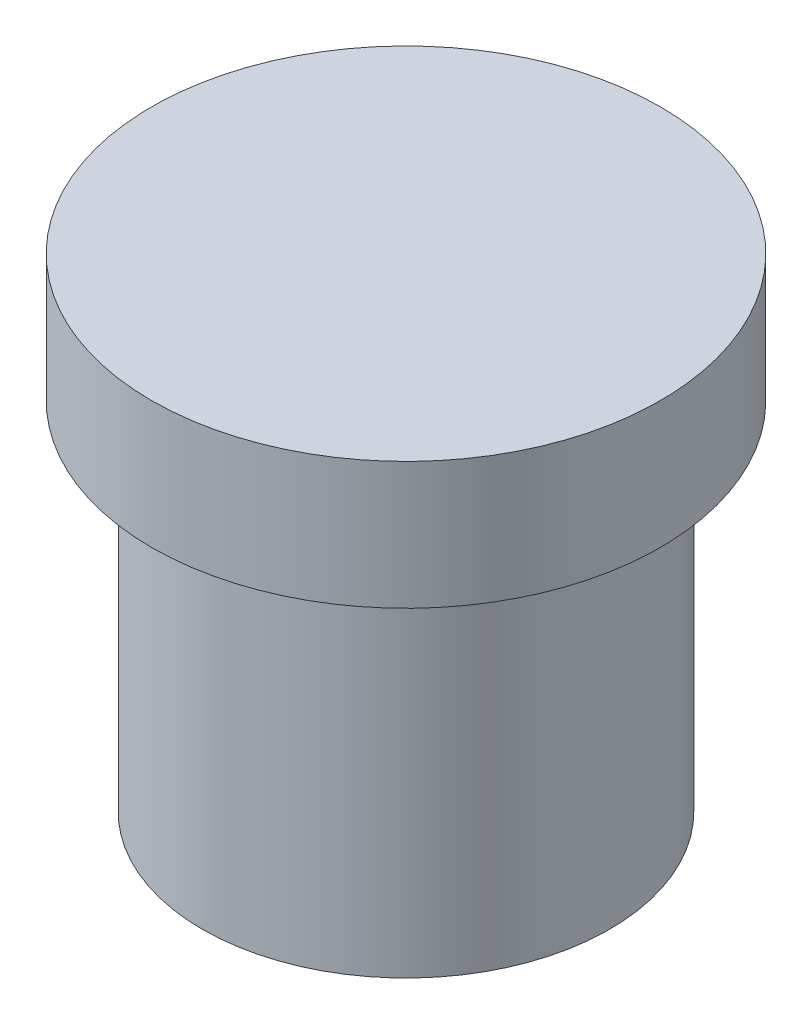
ISO-10303-21;
HEADER;
FILE_DESCRIPTION(('STEP AP214'),'2;1');
FILE_NAME('part.step','',(''),(''),'','','');
FILE_SCHEMA(('AUTOMOTIVE_DESIGN { 1 0 10303 214 1 1 1 1 }'));
ENDSEC;
DATA;
#1=APPLICATION_CONTEXT('core data for automotive mechanical design processes');
#2=APPLICATION_PROTOCOL_DEFINITION('international standard','automotive_design',2000,#1);
#3=PRODUCT_CONTEXT('',#1,'mechanical');
#4=PRODUCT('Part','Part','',(#3));
#5=PRODUCT_RELATED_PRODUCT_CATEGORY('part','',(#4));
#6=PRODUCT_DEFINITION_FORMATION('','',#4);
#7=PRODUCT_DEFINITION_CONTEXT('part definition',#1,'design');
#8=PRODUCT_DEFINITION('design','',#6,#7);
#9=PRODUCT_DEFINITION_SHAPE('','',#8);
#10=(LENGTH_UNIT() NAMED_UNIT(*) SI_UNIT(.MILLI.,.METRE.));
#11=(NAMED_UNIT(*) PLANE_ANGLE_UNIT() SI_UNIT($,.RADIAN.));
#12=(NAMED_UNIT(*) SI_UNIT($,.STERADIAN.) SOLID_ANGLE_UNIT());
#13=UNCERTAINTY_MEASURE_WITH_UNIT(LENGTH_MEASURE(1.E-05),#10,'distance_accuracy_value','');
#14=(GEOMETRIC_REPRESENTATION_CONTEXT(3) GLOBAL_UNCERTAINTY_ASSIGNED_CONTEXT((#13)) GLOBAL_UNIT_ASSIGNED_CONTEXT((#10,
#11,#12)) REPRESENTATION_CONTEXT('',''));
#15=CARTESIAN_POINT('',(0.,0.,0.));
#16=DIRECTION('',(0.,0.,1.));
#17=DIRECTION('',(1.,0.,0.));
#18=AXIS2_PLACEMENT_3D('',#15,#16,#17);
#19=CARTESIAN_POINT('',(0.,700.,0.));
#20=DIRECTION('',(0.,-1.,0.));
#21=DIRECTION('',(0.,0.,-1.));
#22=AXIS2_PLACEMENT_3D('',#19,#20,#21);
#23=CYLINDRICAL_SURFACE('',#22,400.);
#24=CARTESIAN_POINT('',(0.,700.,0.));
#25=DIRECTION('',(0.,1.,0.));
#26=DIRECTION('',(0.,0.,1.));
#27=AXIS2_PLACEMENT_3D('',#24,#25,#26);
#28=CIRCLE('',#27,400.);
#29=CARTESIAN_POINT('',(0.,700.,400.));
#30=VERTEX_POINT('',#29);
#31=EDGE_CURVE('E10',#30,#30,#28,.T.);
#32=ORIENTED_EDGE('',*,*,#31,.F.);
#33=EDGE_LOOP('',(#32));
#34=FACE_BOUND('',#33,.T.);
#35=CARTESIAN_POINT('',(0.,0.,0.));
#36=DIRECTION('',(0.,1.,0.));
#37=DIRECTION('',(0.,0.,1.));
#38=AXIS2_PLACEMENT_3D('',#35,#36,#37);
#39=CIRCLE('',#38,400.);
#40=CARTESIAN_POINT('',(0.,0.,400.));
#41=VERTEX_POINT('',#40);
#42=EDGE_CURVE('E46',#41,#41,#39,.T.);
#43=ORIENTED_EDGE('',*,*,#42,.T.);
#44=EDGE_LOOP('',(#43));
#45=FACE_BOUND('',#44,.T.);
#46=ADVANCED_FACE('F43',(#34,#45),#23,.T.);
#47=CARTESIAN_POINT('',(0.,0.,0.));
#48=DIRECTION('',(0.,1.,0.));
#49=DIRECTION('',(0.,0.,1.));
#50=AXIS2_PLACEMENT_3D('',#47,#48,#49);
#51=PLANE('',#50);
#52=ORIENTED_EDGE('',*,*,#42,.F.);
#53=EDGE_LOOP('',(#52));
#54=FACE_BOUND('',#53,.T.);
#55=ADVANCED_FACE('F70',(#54),#51,.F.);
#56=CARTESIAN_POINT('',(0.,950.,0.));
#57=DIRECTION('',(0.,-1.,0.));
#58=DIRECTION('',(0.,0.,-1.));
#59=AXIS2_PLACEMENT_3D('',#56,#57,#58);
#60=CYLINDRICAL_SURFACE('',#59,500.);
#61=CARTESIAN_POINT('',(0.,950.,0.));
#62=DIRECTION('',(0.,1.,0.));
#63=DIRECTION('',(0.,0.,1.));
#64=AXIS2_PLACEMENT_3D('',#61,#62,#63);
#65=CIRCLE('',#64,500.);
#66=CARTESIAN_POINT('',(0.,950.,500.));
#67=VERTEX_POINT('',#66);
#68=EDGE_CURVE('E55',#67,#67,#65,.T.);
#69=ORIENTED_EDGE('',*,*,#68,.F.);
#70=EDGE_LOOP('',(#69));
#71=FACE_BOUND('',#70,.T.);
#72=CARTESIAN_POINT('',(0.,700.,0.));
#73=DIRECTION('',(0.,1.,0.));
#74=DIRECTION('',(0.,0.,1.));
#75=AXIS2_PLACEMENT_3D('',#72,#73,#74);
#76=CIRCLE('',#75,500.);
#77=CARTESIAN_POINT('',(0.,700.,500.));
#78=VERTEX_POINT('',#77);
#79=EDGE_CURVE('E57',#78,#78,#76,.T.);
#80=ORIENTED_EDGE('',*,*,#79,.T.);
#81=EDGE_LOOP('',(#80));
#82=FACE_BOUND('',#81,.T.);
#83=ADVANCED_FACE('F67',(#71,#82),#60,.T.);
#84=CARTESIAN_POINT('',(0.,950.,0.));
#85=DIRECTION('',(0.,1.,0.));
#86=DIRECTION('',(0.,0.,1.));
#87=AXIS2_PLACEMENT_3D('',#84,#85,#86);
#88=PLANE('',#87);
#89=ORIENTED_EDGE('',*,*,#68,.T.);
#90=EDGE_LOOP('',(#89));
#91=FACE_BOUND('',#90,.T.);
#92=ADVANCED_FACE('F65',(#91),#88,.T.);
#93=CARTESIAN_POINT('',(0.,700.,0.));
#94=DIRECTION('',(0.,1.,0.));
#95=DIRECTION('',(0.,0.,1.));
#96=AXIS2_PLACEMENT_3D('',#93,#94,#95);
#97=PLANE('',#96);
#98=ORIENTED_EDGE('',*,*,#31,.T.);
#99=EDGE_LOOP('',(#98));
#100=FACE_BOUND('',#99,.T.);
#101=ORIENTED_EDGE('',*,*,#79,.F.);
#102=EDGE_LOOP('',(#101));
#103=FACE_BOUND('',#102,.T.);
#104=ADVANCED_FACE('F74',(#100,#103),#97,.F.);
#105=CLOSED_SHELL('',(#46,#55,#83,#92,#104));
#106=MANIFOLD_SOLID_BREP('B2',#105);
#107=ADVANCED_BREP_SHAPE_REPRESENTATION('',(#18,#106),#14);
#108=SHAPE_DEFINITION_REPRESENTATION(#9,#107);
ENDSEC;
END-ISO-10303-21;
